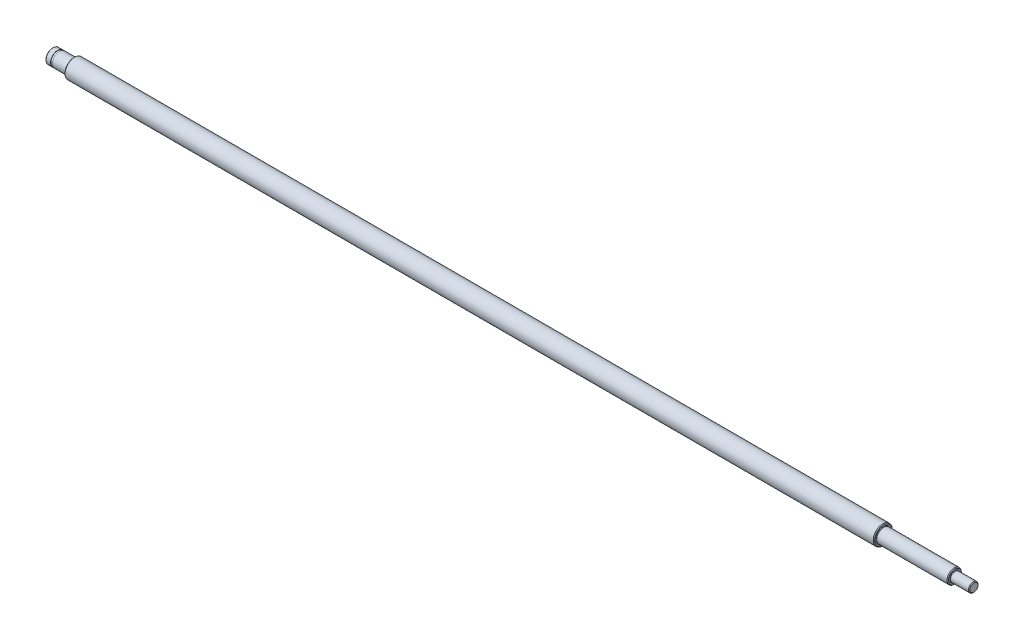
ISO-10303-21;
HEADER;
FILE_DESCRIPTION(('STEP AP214'),'2;1');
FILE_NAME('part.step','',(''),(''),'','','');
FILE_SCHEMA(('AUTOMOTIVE_DESIGN { 1 0 10303 214 1 1 1 1 }'));
ENDSEC;
DATA;
#1=APPLICATION_CONTEXT('core data for automotive mechanical design processes');
#2=APPLICATION_PROTOCOL_DEFINITION('international standard','automotive_design',2000,#1);
#3=PRODUCT_CONTEXT('',#1,'mechanical');
#4=PRODUCT('Part','Part','',(#3));
#5=PRODUCT_RELATED_PRODUCT_CATEGORY('part','',(#4));
#6=PRODUCT_DEFINITION_FORMATION('','',#4);
#7=PRODUCT_DEFINITION_CONTEXT('part definition',#1,'design');
#8=PRODUCT_DEFINITION('design','',#6,#7);
#9=PRODUCT_DEFINITION_SHAPE('','',#8);
#10=(LENGTH_UNIT() NAMED_UNIT(*) SI_UNIT(.MILLI.,.METRE.));
#11=(NAMED_UNIT(*) PLANE_ANGLE_UNIT() SI_UNIT($,.RADIAN.));
#12=(NAMED_UNIT(*) SI_UNIT($,.STERADIAN.) SOLID_ANGLE_UNIT());
#13=UNCERTAINTY_MEASURE_WITH_UNIT(LENGTH_MEASURE(1.E-05),#10,'distance_accuracy_value','');
#14=(GEOMETRIC_REPRESENTATION_CONTEXT(3) GLOBAL_UNCERTAINTY_ASSIGNED_CONTEXT((#13)) GLOBAL_UNIT_ASSIGNED_CONTEXT((#10,
#11,#12)) REPRESENTATION_CONTEXT('',''));
#15=CARTESIAN_POINT('',(0.,0.,0.));
#16=DIRECTION('',(0.,0.,1.));
#17=DIRECTION('',(1.,0.,0.));
#18=AXIS2_PLACEMENT_3D('',#15,#16,#17);
#19=CARTESIAN_POINT('',(386.7,0.,0.));
#20=DIRECTION('',(-1.,0.,0.));
#21=DIRECTION('',(0.,-1.,0.));
#22=AXIS2_PLACEMENT_3D('',#19,#20,#21);
#23=CONICAL_SURFACE('',#22,2.00000000000008,0.785398163397394);
#24=CARTESIAN_POINT('',(387.,0.,0.));
#25=DIRECTION('',(-1.,0.,0.));
#26=DIRECTION('',(0.,-1.,0.));
#27=AXIS2_PLACEMENT_3D('',#24,#25,#26);
#28=CIRCLE('',#27,1.70000000000015);
#29=CARTESIAN_POINT('',(387.,-1.70000000000015,0.));
#30=VERTEX_POINT('',#29);
#31=EDGE_CURVE('E128',#30,#30,#28,.T.);
#32=ORIENTED_EDGE('',*,*,#31,.T.);
#33=EDGE_LOOP('',(#32));
#34=FACE_BOUND('',#33,.T.);
#35=CARTESIAN_POINT('',(386.7,0.,0.));
#36=DIRECTION('',(-1.,0.,0.));
#37=DIRECTION('',(0.,-1.,0.));
#38=AXIS2_PLACEMENT_3D('',#35,#36,#37);
#39=CIRCLE('',#38,2.00000000000008);
#40=CARTESIAN_POINT('',(386.7,-2.00000000000008,0.));
#41=VERTEX_POINT('',#40);
#42=EDGE_CURVE('E10',#41,#41,#39,.T.);
#43=ORIENTED_EDGE('',*,*,#42,.F.);
#44=EDGE_LOOP('',(#43));
#45=FACE_BOUND('',#44,.T.);
#46=ADVANCED_FACE('F45',(#34,#45),#23,.T.);
#47=CARTESIAN_POINT('',(387.,0.,0.));
#48=DIRECTION('',(-1.,0.,0.));
#49=DIRECTION('',(0.,-1.,0.));
#50=AXIS2_PLACEMENT_3D('',#47,#48,#49);
#51=CYLINDRICAL_SURFACE('',#50,2.00000000000008);
#52=ORIENTED_EDGE('',*,*,#42,.T.);
#53=EDGE_LOOP('',(#52));
#54=FACE_BOUND('',#53,.T.);
#55=CARTESIAN_POINT('',(379.2,0.,0.));
#56=DIRECTION('',(-1.,0.,0.));
#57=DIRECTION('',(0.,-1.,0.));
#58=AXIS2_PLACEMENT_3D('',#55,#56,#57);
#59=CIRCLE('',#58,2.00000000000007);
#60=CARTESIAN_POINT('',(379.2,-2.00000000000007,0.));
#61=VERTEX_POINT('',#60);
#62=EDGE_CURVE('E52',#61,#61,#59,.T.);
#63=ORIENTED_EDGE('',*,*,#62,.F.);
#64=EDGE_LOOP('',(#63));
#65=FACE_BOUND('',#64,.T.);
#66=ADVANCED_FACE('F145',(#54,#65),#51,.T.);
#67=CARTESIAN_POINT('',(379.2,0.,0.));
#68=DIRECTION('',(-1.,0.,0.));
#69=DIRECTION('',(0.,-1.,0.));
#70=AXIS2_PLACEMENT_3D('',#67,#68,#69);
#71=TOROIDAL_SURFACE('',#70,2.20000000000009,0.200000000000022);
#72=ORIENTED_EDGE('',*,*,#62,.T.);
#73=EDGE_LOOP('',(#72));
#74=FACE_BOUND('',#73,.T.);
#75=CARTESIAN_POINT('',(379.,0.,0.));
#76=DIRECTION('',(-1.,0.,0.));
#77=DIRECTION('',(0.,-1.,0.));
#78=AXIS2_PLACEMENT_3D('',#75,#76,#77);
#79=CIRCLE('',#78,2.20000000000009);
#80=CARTESIAN_POINT('',(379.,-2.20000000000009,0.));
#81=VERTEX_POINT('',#80);
#82=EDGE_CURVE('E59',#81,#81,#79,.T.);
#83=ORIENTED_EDGE('',*,*,#82,.F.);
#84=EDGE_LOOP('',(#83));
#85=FACE_BOUND('',#84,.T.);
#86=ADVANCED_FACE('F148',(#74,#85),#71,.F.);
#87=CARTESIAN_POINT('',(379.,2.7000000000001,0.));
#88=DIRECTION('',(1.,0.,0.));
#89=DIRECTION('',(0.,1.,0.));
#90=AXIS2_PLACEMENT_3D('',#87,#88,#89);
#91=PLANE('',#90);
#92=ORIENTED_EDGE('',*,*,#82,.T.);
#93=EDGE_LOOP('',(#92));
#94=FACE_BOUND('',#93,.T.);
#95=CARTESIAN_POINT('',(379.,0.,0.));
#96=DIRECTION('',(-1.,0.,0.));
#97=DIRECTION('',(0.,-1.,0.));
#98=AXIS2_PLACEMENT_3D('',#95,#96,#97);
#99=CIRCLE('',#98,2.7000000000001);
#100=CARTESIAN_POINT('',(379.,-2.7000000000001,0.));
#101=VERTEX_POINT('',#100);
#102=EDGE_CURVE('E64',#101,#101,#99,.T.);
#103=ORIENTED_EDGE('',*,*,#102,.F.);
#104=EDGE_LOOP('',(#103));
#105=FACE_BOUND('',#104,.T.);
#106=ADVANCED_FACE('F151',(#94,#105),#91,.T.);
#107=CARTESIAN_POINT('',(378.7,0.,0.));
#108=DIRECTION('',(-1.,0.,0.));
#109=DIRECTION('',(0.,-1.,0.));
#110=AXIS2_PLACEMENT_3D('',#107,#108,#109);
#111=CONICAL_SURFACE('',#110,3.00000000000004,0.785398163397505);
#112=ORIENTED_EDGE('',*,*,#102,.T.);
#113=EDGE_LOOP('',(#112));
#114=FACE_BOUND('',#113,.T.);
#115=CARTESIAN_POINT('',(378.7,0.,0.));
#116=DIRECTION('',(-1.,0.,0.));
#117=DIRECTION('',(0.,-1.,0.));
#118=AXIS2_PLACEMENT_3D('',#115,#116,#117);
#119=CIRCLE('',#118,3.00000000000004);
#120=CARTESIAN_POINT('',(378.7,-3.00000000000004,0.));
#121=VERTEX_POINT('',#120);
#122=EDGE_CURVE('E69',#121,#121,#119,.T.);
#123=ORIENTED_EDGE('',*,*,#122,.F.);
#124=EDGE_LOOP('',(#123));
#125=FACE_BOUND('',#124,.T.);
#126=ADVANCED_FACE('F157',(#114,#125),#111,.T.);
#127=CARTESIAN_POINT('',(387.,0.,0.));
#128=DIRECTION('',(-1.,0.,0.));
#129=DIRECTION('',(0.,-1.,0.));
#130=AXIS2_PLACEMENT_3D('',#127,#128,#129);
#131=CYLINDRICAL_SURFACE('',#130,3.00000000000002);
#132=ORIENTED_EDGE('',*,*,#122,.T.);
#133=EDGE_LOOP('',(#132));
#134=FACE_BOUND('',#133,.T.);
#135=CARTESIAN_POINT('',(349.2,0.,0.));
#136=DIRECTION('',(-1.,0.,0.));
#137=DIRECTION('',(0.,-1.,0.));
#138=AXIS2_PLACEMENT_3D('',#135,#136,#137);
#139=CIRCLE('',#138,3.00000000000001);
#140=CARTESIAN_POINT('',(349.2,-3.00000000000001,0.));
#141=VERTEX_POINT('',#140);
#142=EDGE_CURVE('E73',#141,#141,#139,.T.);
#143=ORIENTED_EDGE('',*,*,#142,.F.);
#144=EDGE_LOOP('',(#143));
#145=FACE_BOUND('',#144,.T.);
#146=ADVANCED_FACE('F161',(#134,#145),#131,.T.);
#147=CARTESIAN_POINT('',(349.2,0.,0.));
#148=DIRECTION('',(-1.,0.,0.));
#149=DIRECTION('',(0.,-1.,0.));
#150=AXIS2_PLACEMENT_3D('',#147,#148,#149);
#151=TOROIDAL_SURFACE('',#150,3.20000000000006,0.20000000000005);
#152=ORIENTED_EDGE('',*,*,#142,.T.);
#153=EDGE_LOOP('',(#152));
#154=FACE_BOUND('',#153,.T.);
#155=CARTESIAN_POINT('',(349.,0.,0.));
#156=DIRECTION('',(-1.,0.,0.));
#157=DIRECTION('',(0.,-1.,0.));
#158=AXIS2_PLACEMENT_3D('',#155,#156,#157);
#159=CIRCLE('',#158,3.20000000000006);
#160=CARTESIAN_POINT('',(349.,-3.20000000000006,0.));
#161=VERTEX_POINT('',#160);
#162=EDGE_CURVE('E77',#161,#161,#159,.T.);
#163=ORIENTED_EDGE('',*,*,#162,.F.);
#164=EDGE_LOOP('',(#163));
#165=FACE_BOUND('',#164,.T.);
#166=ADVANCED_FACE('F165',(#154,#165),#151,.F.);
#167=CARTESIAN_POINT('',(349.,3.70000000000018,0.));
#168=DIRECTION('',(1.,0.,0.));
#169=DIRECTION('',(0.,1.,0.));
#170=AXIS2_PLACEMENT_3D('',#167,#168,#169);
#171=PLANE('',#170);
#172=ORIENTED_EDGE('',*,*,#162,.T.);
#173=EDGE_LOOP('',(#172));
#174=FACE_BOUND('',#173,.T.);
#175=CARTESIAN_POINT('',(349.,0.,0.));
#176=DIRECTION('',(-1.,0.,0.));
#177=DIRECTION('',(0.,-1.,0.));
#178=AXIS2_PLACEMENT_3D('',#175,#176,#177);
#179=CIRCLE('',#178,3.70000000000018);
#180=CARTESIAN_POINT('',(349.,-3.70000000000018,0.));
#181=VERTEX_POINT('',#180);
#182=EDGE_CURVE('E81',#181,#181,#179,.T.);
#183=ORIENTED_EDGE('',*,*,#182,.F.);
#184=EDGE_LOOP('',(#183));
#185=FACE_BOUND('',#184,.T.);
#186=ADVANCED_FACE('F169',(#174,#185),#171,.T.);
#187=CARTESIAN_POINT('',(348.7,0.,0.));
#188=DIRECTION('',(-1.,0.,0.));
#189=DIRECTION('',(0.,-1.,0.));
#190=AXIS2_PLACEMENT_3D('',#187,#188,#189);
#191=CONICAL_SURFACE('',#190,4.00000000000018,0.785398163397405);
#192=ORIENTED_EDGE('',*,*,#182,.T.);
#193=EDGE_LOOP('',(#192));
#194=FACE_BOUND('',#193,.T.);
#195=CARTESIAN_POINT('',(348.7,0.,0.));
#196=DIRECTION('',(-1.,0.,0.));
#197=DIRECTION('',(0.,-1.,0.));
#198=AXIS2_PLACEMENT_3D('',#195,#196,#197);
#199=CIRCLE('',#198,4.00000000000018);
#200=CARTESIAN_POINT('',(348.7,-4.00000000000018,0.));
#201=VERTEX_POINT('',#200);
#202=EDGE_CURVE('E85',#201,#201,#199,.T.);
#203=ORIENTED_EDGE('',*,*,#202,.F.);
#204=EDGE_LOOP('',(#203));
#205=FACE_BOUND('',#204,.T.);
#206=ADVANCED_FACE('F173',(#194,#205),#191,.T.);
#207=CARTESIAN_POINT('',(387.,0.,0.));
#208=DIRECTION('',(-1.,0.,0.));
#209=DIRECTION('',(0.,-1.,0.));
#210=AXIS2_PLACEMENT_3D('',#207,#208,#209);
#211=CYLINDRICAL_SURFACE('',#210,4.0000000000002);
#212=ORIENTED_EDGE('',*,*,#202,.T.);
#213=EDGE_LOOP('',(#212));
#214=FACE_BOUND('',#213,.T.);
#215=CARTESIAN_POINT('',(9.29999999999992,0.,0.));
#216=DIRECTION('',(-1.,0.,0.));
#217=DIRECTION('',(0.,-1.,0.));
#218=AXIS2_PLACEMENT_3D('',#215,#216,#217);
#219=CIRCLE('',#218,4.00000000000022);
#220=CARTESIAN_POINT('',(9.29999999999992,-4.00000000000022,0.));
#221=VERTEX_POINT('',#220);
#222=EDGE_CURVE('E88',#221,#221,#219,.T.);
#223=ORIENTED_EDGE('',*,*,#222,.F.);
#224=EDGE_LOOP('',(#223));
#225=FACE_BOUND('',#224,.T.);
#226=ADVANCED_FACE('F177',(#214,#225),#211,.T.);
#227=CARTESIAN_POINT('',(9.00000000000001,0.,0.));
#228=DIRECTION('',(1.,0.,0.));
#229=DIRECTION('',(0.,1.,0.));
#230=AXIS2_PLACEMENT_3D('',#227,#228,#229);
#231=CONICAL_SURFACE('',#230,3.70000000000015,0.785398163397714);
#232=ORIENTED_EDGE('',*,*,#222,.T.);
#233=EDGE_LOOP('',(#232));
#234=FACE_BOUND('',#233,.T.);
#235=CARTESIAN_POINT('',(9.00000000000001,0.,0.));
#236=DIRECTION('',(-1.,0.,0.));
#237=DIRECTION('',(0.,-1.,0.));
#238=AXIS2_PLACEMENT_3D('',#235,#236,#237);
#239=CIRCLE('',#238,3.70000000000015);
#240=CARTESIAN_POINT('',(9.00000000000001,-3.70000000000015,0.));
#241=VERTEX_POINT('',#240);
#242=EDGE_CURVE('E92',#241,#241,#239,.T.);
#243=ORIENTED_EDGE('',*,*,#242,.F.);
#244=EDGE_LOOP('',(#243));
#245=FACE_BOUND('',#244,.T.);
#246=ADVANCED_FACE('F181',(#234,#245),#231,.T.);
#247=CARTESIAN_POINT('',(9.,3.2,0.));
#248=DIRECTION('',(-1.,0.,0.));
#249=DIRECTION('',(0.,-1.,0.));
#250=AXIS2_PLACEMENT_3D('',#247,#248,#249);
#251=PLANE('',#250);
#252=ORIENTED_EDGE('',*,*,#242,.T.);
#253=EDGE_LOOP('',(#252));
#254=FACE_BOUND('',#253,.T.);
#255=CARTESIAN_POINT('',(9.00000000000001,0.,0.));
#256=DIRECTION('',(-1.,0.,0.));
#257=DIRECTION('',(0.,-1.,0.));
#258=AXIS2_PLACEMENT_3D('',#255,#256,#257);
#259=CIRCLE('',#258,3.2);
#260=CARTESIAN_POINT('',(9.00000000000001,-3.2,0.));
#261=VERTEX_POINT('',#260);
#262=EDGE_CURVE('E96',#261,#261,#259,.T.);
#263=ORIENTED_EDGE('',*,*,#262,.F.);
#264=EDGE_LOOP('',(#263));
#265=FACE_BOUND('',#264,.T.);
#266=ADVANCED_FACE('F185',(#254,#265),#251,.T.);
#267=CARTESIAN_POINT('',(8.8,0.,0.));
#268=DIRECTION('',(-1.,0.,0.));
#269=DIRECTION('',(0.,-1.,0.));
#270=AXIS2_PLACEMENT_3D('',#267,#268,#269);
#271=TOROIDAL_SURFACE('',#270,3.2,0.200000000000001);
#272=ORIENTED_EDGE('',*,*,#262,.T.);
#273=EDGE_LOOP('',(#272));
#274=FACE_BOUND('',#273,.T.);
#275=CARTESIAN_POINT('',(8.79999999999997,0.,0.));
#276=DIRECTION('',(-1.,0.,0.));
#277=DIRECTION('',(0.,-1.,0.));
#278=AXIS2_PLACEMENT_3D('',#275,#276,#277);
#279=CIRCLE('',#278,3.);
#280=CARTESIAN_POINT('',(8.79999999999997,-3.,0.));
#281=VERTEX_POINT('',#280);
#282=EDGE_CURVE('E100',#281,#281,#279,.T.);
#283=ORIENTED_EDGE('',*,*,#282,.F.);
#284=EDGE_LOOP('',(#283));
#285=FACE_BOUND('',#284,.T.);
#286=ADVANCED_FACE('F189',(#274,#285),#271,.F.);
#287=CARTESIAN_POINT('',(387.,0.,0.));
#288=DIRECTION('',(-1.,0.,0.));
#289=DIRECTION('',(0.,-1.,0.));
#290=AXIS2_PLACEMENT_3D('',#287,#288,#289);
#291=CYLINDRICAL_SURFACE('',#290,3.);
#292=ORIENTED_EDGE('',*,*,#282,.T.);
#293=EDGE_LOOP('',(#292));
#294=FACE_BOUND('',#293,.T.);
#295=CARTESIAN_POINT('',(3.00000000000017,0.,0.));
#296=DIRECTION('',(-1.,0.,0.));
#297=DIRECTION('',(0.,-1.,0.));
#298=AXIS2_PLACEMENT_3D('',#295,#296,#297);
#299=CIRCLE('',#298,3.);
#300=CARTESIAN_POINT('',(3.00000000000017,-3.,0.));
#301=VERTEX_POINT('',#300);
#302=EDGE_CURVE('E104',#301,#301,#299,.T.);
#303=ORIENTED_EDGE('',*,*,#302,.F.);
#304=EDGE_LOOP('',(#303));
#305=FACE_BOUND('',#304,.T.);
#306=ADVANCED_FACE('F193',(#294,#305),#291,.T.);
#307=CARTESIAN_POINT('',(3.0000000000002,2.8499999999999,0.));
#308=DIRECTION('',(-1.,0.,0.));
#309=DIRECTION('',(0.,-1.,0.));
#310=AXIS2_PLACEMENT_3D('',#307,#308,#309);
#311=PLANE('',#310);
#312=ORIENTED_EDGE('',*,*,#302,.T.);
#313=EDGE_LOOP('',(#312));
#314=FACE_BOUND('',#313,.T.);
#315=CARTESIAN_POINT('',(3.00000000000017,0.,0.));
#316=DIRECTION('',(-1.,0.,0.));
#317=DIRECTION('',(0.,-1.,0.));
#318=AXIS2_PLACEMENT_3D('',#315,#316,#317);
#319=CIRCLE('',#318,2.8499999999999);
#320=CARTESIAN_POINT('',(3.00000000000017,-2.8499999999999,0.));
#321=VERTEX_POINT('',#320);
#322=EDGE_CURVE('E108',#321,#321,#319,.T.);
#323=ORIENTED_EDGE('',*,*,#322,.F.);
#324=EDGE_LOOP('',(#323));
#325=FACE_BOUND('',#324,.T.);
#326=ADVANCED_FACE('F197',(#314,#325),#311,.T.);
#327=CARTESIAN_POINT('',(387.,0.,0.));
#328=DIRECTION('',(-1.,0.,0.));
#329=DIRECTION('',(0.,-1.,0.));
#330=AXIS2_PLACEMENT_3D('',#327,#328,#329);
#331=CYLINDRICAL_SURFACE('',#330,2.8499999999999);
#332=ORIENTED_EDGE('',*,*,#322,.T.);
#333=EDGE_LOOP('',(#332));
#334=FACE_BOUND('',#333,.T.);
#335=CARTESIAN_POINT('',(2.19999999999998,0.,0.));
#336=DIRECTION('',(-1.,0.,0.));
#337=DIRECTION('',(0.,-1.,0.));
#338=AXIS2_PLACEMENT_3D('',#335,#336,#337);
#339=CIRCLE('',#338,2.8499999999999);
#340=CARTESIAN_POINT('',(2.19999999999998,-2.8499999999999,0.));
#341=VERTEX_POINT('',#340);
#342=EDGE_CURVE('E112',#341,#341,#339,.T.);
#343=ORIENTED_EDGE('',*,*,#342,.F.);
#344=EDGE_LOOP('',(#343));
#345=FACE_BOUND('',#344,.T.);
#346=ADVANCED_FACE('F201',(#334,#345),#331,.T.);
#347=CARTESIAN_POINT('',(2.2,3.,0.));
#348=DIRECTION('',(1.,0.,0.));
#349=DIRECTION('',(0.,1.,0.));
#350=AXIS2_PLACEMENT_3D('',#347,#348,#349);
#351=PLANE('',#350);
#352=ORIENTED_EDGE('',*,*,#342,.T.);
#353=EDGE_LOOP('',(#352));
#354=FACE_BOUND('',#353,.T.);
#355=CARTESIAN_POINT('',(2.19999999999998,0.,0.));
#356=DIRECTION('',(-1.,0.,0.));
#357=DIRECTION('',(0.,-1.,0.));
#358=AXIS2_PLACEMENT_3D('',#355,#356,#357);
#359=CIRCLE('',#358,3.);
#360=CARTESIAN_POINT('',(2.19999999999998,-3.,0.));
#361=VERTEX_POINT('',#360);
#362=EDGE_CURVE('E116',#361,#361,#359,.T.);
#363=ORIENTED_EDGE('',*,*,#362,.F.);
#364=EDGE_LOOP('',(#363));
#365=FACE_BOUND('',#364,.T.);
#366=ADVANCED_FACE('F205',(#354,#365),#351,.T.);
#367=CARTESIAN_POINT('',(387.,0.,0.));
#368=DIRECTION('',(-1.,0.,0.));
#369=DIRECTION('',(0.,-1.,0.));
#370=AXIS2_PLACEMENT_3D('',#367,#368,#369);
#371=CYLINDRICAL_SURFACE('',#370,3.);
#372=ORIENTED_EDGE('',*,*,#362,.T.);
#373=EDGE_LOOP('',(#372));
#374=FACE_BOUND('',#373,.T.);
#375=CARTESIAN_POINT('',(0.299999999999967,0.,0.));
#376=DIRECTION('',(-1.,0.,0.));
#377=DIRECTION('',(0.,-1.,0.));
#378=AXIS2_PLACEMENT_3D('',#375,#376,#377);
#379=CIRCLE('',#378,3.);
#380=CARTESIAN_POINT('',(0.299999999999967,-3.,0.));
#381=VERTEX_POINT('',#380);
#382=EDGE_CURVE('E120',#381,#381,#379,.T.);
#383=ORIENTED_EDGE('',*,*,#382,.F.);
#384=EDGE_LOOP('',(#383));
#385=FACE_BOUND('',#384,.T.);
#386=ADVANCED_FACE('F209',(#374,#385),#371,.T.);
#387=CARTESIAN_POINT('',(0.,0.,0.));
#388=DIRECTION('',(1.,0.,0.));
#389=DIRECTION('',(0.,1.,0.));
#390=AXIS2_PLACEMENT_3D('',#387,#388,#389);
#391=CONICAL_SURFACE('',#390,2.70000000000002,0.785398163397471);
#392=ORIENTED_EDGE('',*,*,#382,.T.);
#393=EDGE_LOOP('',(#392));
#394=FACE_BOUND('',#393,.T.);
#395=CARTESIAN_POINT('',(0.,0.,0.));
#396=DIRECTION('',(-1.,0.,0.));
#397=DIRECTION('',(0.,-1.,0.));
#398=AXIS2_PLACEMENT_3D('',#395,#396,#397);
#399=CIRCLE('',#398,2.70000000000002);
#400=CARTESIAN_POINT('',(0.,-2.70000000000002,0.));
#401=VERTEX_POINT('',#400);
#402=EDGE_CURVE('E124',#401,#401,#399,.T.);
#403=ORIENTED_EDGE('',*,*,#402,.F.);
#404=EDGE_LOOP('',(#403));
#405=FACE_BOUND('',#404,.T.);
#406=ADVANCED_FACE('F141',(#394,#405),#391,.T.);
#407=CARTESIAN_POINT('',(0.,0.,0.));
#408=DIRECTION('',(-1.,0.,0.));
#409=DIRECTION('',(0.,-1.,0.));
#410=AXIS2_PLACEMENT_3D('',#407,#408,#409);
#411=PLANE('',#410);
#412=ORIENTED_EDGE('',*,*,#402,.T.);
#413=EDGE_LOOP('',(#412));
#414=FACE_BOUND('',#413,.T.);
#415=ADVANCED_FACE('F137',(#414),#411,.T.);
#416=CARTESIAN_POINT('',(387.,1.70000000000015,0.));
#417=DIRECTION('',(1.,0.,0.));
#418=DIRECTION('',(0.,1.,0.));
#419=AXIS2_PLACEMENT_3D('',#416,#417,#418);
#420=PLANE('',#419);
#421=ORIENTED_EDGE('',*,*,#31,.F.);
#422=EDGE_LOOP('',(#421));
#423=FACE_BOUND('',#422,.T.);
#424=ADVANCED_FACE('F135',(#423),#420,.T.);
#425=CLOSED_SHELL('',(#46,#66,#86,#106,#126,#146,#166,#186,#206,#226,#246,#266,#286,#306,#326,
#346,#366,#386,#406,#415,#424));
#426=MANIFOLD_SOLID_BREP('B2',#425);
#427=ADVANCED_BREP_SHAPE_REPRESENTATION('',(#18,#426),#14);
#428=SHAPE_DEFINITION_REPRESENTATION(#9,#427);
ENDSEC;
END-ISO-10303-21;
